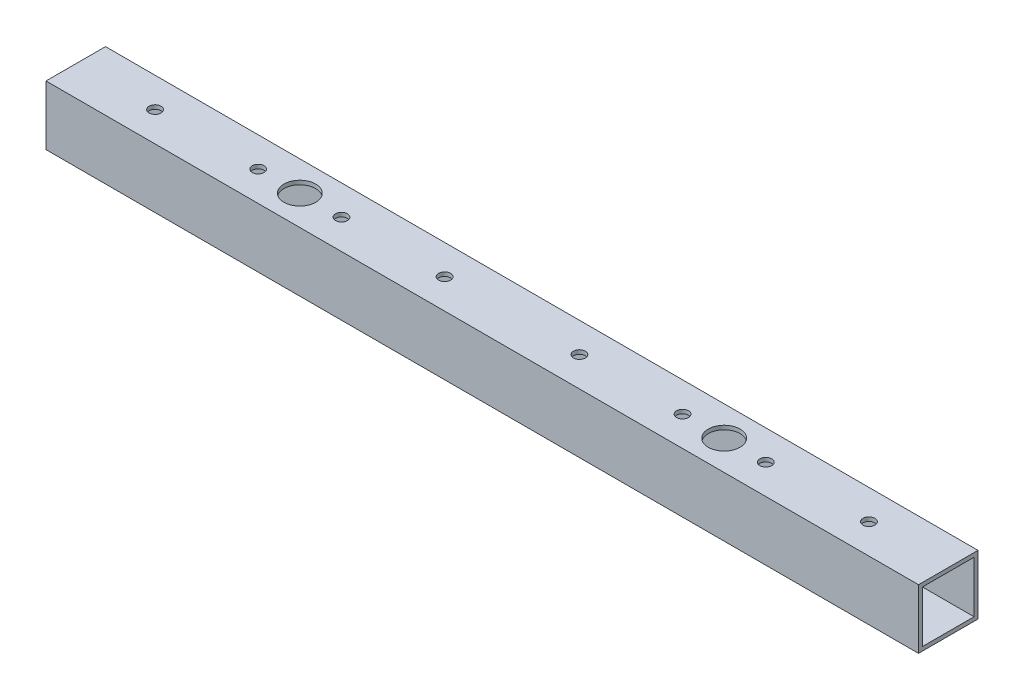
ISO-10303-21;
HEADER;
FILE_DESCRIPTION(('STEP AP214'),'2;1');
FILE_NAME('part.step','',(''),(''),'','','');
FILE_SCHEMA(('AUTOMOTIVE_DESIGN { 1 0 10303 214 1 1 1 1 }'));
ENDSEC;
DATA;
#1=APPLICATION_CONTEXT('core data for automotive mechanical design processes');
#2=APPLICATION_PROTOCOL_DEFINITION('international standard','automotive_design',2000,#1);
#3=PRODUCT_CONTEXT('',#1,'mechanical');
#4=PRODUCT('Part','Part','',(#3));
#5=PRODUCT_RELATED_PRODUCT_CATEGORY('part','',(#4));
#6=PRODUCT_DEFINITION_FORMATION('','',#4);
#7=PRODUCT_DEFINITION_CONTEXT('part definition',#1,'design');
#8=PRODUCT_DEFINITION('design','',#6,#7);
#9=PRODUCT_DEFINITION_SHAPE('','',#8);
#10=(LENGTH_UNIT() NAMED_UNIT(*) SI_UNIT(.MILLI.,.METRE.));
#11=(NAMED_UNIT(*) PLANE_ANGLE_UNIT() SI_UNIT($,.RADIAN.));
#12=(NAMED_UNIT(*) SI_UNIT($,.STERADIAN.) SOLID_ANGLE_UNIT());
#13=UNCERTAINTY_MEASURE_WITH_UNIT(LENGTH_MEASURE(1.E-05),#10,'distance_accuracy_value','');
#14=(GEOMETRIC_REPRESENTATION_CONTEXT(3) GLOBAL_UNCERTAINTY_ASSIGNED_CONTEXT((#13)) GLOBAL_UNIT_ASSIGNED_CONTEXT((#10,
#11,#12)) REPRESENTATION_CONTEXT('',''));
#15=CARTESIAN_POINT('',(0.,0.,0.));
#16=DIRECTION('',(0.,0.,1.));
#17=DIRECTION('',(1.,0.,0.));
#18=AXIS2_PLACEMENT_3D('',#15,#16,#17);
#19=CARTESIAN_POINT('',(220.,0.,0.));
#20=DIRECTION('',(-1.,0.,0.));
#21=DIRECTION('',(0.,0.,1.));
#22=AXIS2_PLACEMENT_3D('',#19,#20,#21);
#23=PLANE('',#22);
#24=DIRECTION('',(0.,1.,0.));
#25=VECTOR('',#24,1.);
#26=CARTESIAN_POINT('',(220.,-7.5,-7.5));
#27=LINE('',#26,#25);
#28=CARTESIAN_POINT('',(220.,-7.5,-7.5));
#29=VERTEX_POINT('',#28);
#30=CARTESIAN_POINT('',(220.,7.5,-7.5));
#31=VERTEX_POINT('',#30);
#32=EDGE_CURVE('E142',#29,#31,#27,.T.);
#33=ORIENTED_EDGE('',*,*,#32,.T.);
#34=DIRECTION('',(0.,0.,1.));
#35=VECTOR('',#34,1.);
#36=CARTESIAN_POINT('',(220.,7.5,7.5));
#37=LINE('',#36,#35);
#38=CARTESIAN_POINT('',(220.,7.5,7.5));
#39=VERTEX_POINT('',#38);
#40=EDGE_CURVE('E145',#31,#39,#37,.T.);
#41=ORIENTED_EDGE('',*,*,#40,.T.);
#42=DIRECTION('',(0.,-1.,0.));
#43=VECTOR('',#42,1.);
#44=CARTESIAN_POINT('',(220.,-7.5,7.5));
#45=LINE('',#44,#43);
#46=CARTESIAN_POINT('',(220.,-7.5,7.5));
#47=VERTEX_POINT('',#46);
#48=EDGE_CURVE('E148',#39,#47,#45,.T.);
#49=ORIENTED_EDGE('',*,*,#48,.T.);
#50=DIRECTION('',(0.,0.,-1.));
#51=VECTOR('',#50,1.);
#52=CARTESIAN_POINT('',(220.,-7.5,7.5));
#53=LINE('',#52,#51);
#54=EDGE_CURVE('E150',#47,#29,#53,.T.);
#55=ORIENTED_EDGE('',*,*,#54,.T.);
#56=EDGE_LOOP('',(#33,#41,#49,#55));
#57=FACE_BOUND('',#56,.T.);
#58=DIRECTION('',(0.,-1.,0.));
#59=VECTOR('',#58,1.);
#60=CARTESIAN_POINT('',(220.,-6.5,6.5));
#61=LINE('',#60,#59);
#62=CARTESIAN_POINT('',(220.,6.5,6.5));
#63=VERTEX_POINT('',#62);
#64=CARTESIAN_POINT('',(220.,-6.5,6.5));
#65=VERTEX_POINT('',#64);
#66=EDGE_CURVE('E104',#63,#65,#61,.T.);
#67=ORIENTED_EDGE('',*,*,#66,.F.);
#68=DIRECTION('',(0.,0.,1.));
#69=VECTOR('',#68,1.);
#70=CARTESIAN_POINT('',(220.,6.5,6.5));
#71=LINE('',#70,#69);
#72=CARTESIAN_POINT('',(220.,6.5,-6.5));
#73=VERTEX_POINT('',#72);
#74=EDGE_CURVE('E126',#73,#63,#71,.T.);
#75=ORIENTED_EDGE('',*,*,#74,.F.);
#76=DIRECTION('',(0.,1.,0.));
#77=VECTOR('',#76,1.);
#78=CARTESIAN_POINT('',(220.,-6.5,-6.5));
#79=LINE('',#78,#77);
#80=CARTESIAN_POINT('',(220.,-6.5,-6.5));
#81=VERTEX_POINT('',#80);
#82=EDGE_CURVE('E124',#81,#73,#79,.T.);
#83=ORIENTED_EDGE('',*,*,#82,.F.);
#84=DIRECTION('',(0.,0.,-1.));
#85=VECTOR('',#84,1.);
#86=CARTESIAN_POINT('',(220.,-6.5,6.5));
#87=LINE('',#86,#85);
#88=EDGE_CURVE('E112',#65,#81,#87,.T.);
#89=ORIENTED_EDGE('',*,*,#88,.F.);
#90=EDGE_LOOP('',(#67,#75,#83,#89));
#91=FACE_BOUND('',#90,.T.);
#92=ADVANCED_FACE('F37',(#57,#91),#23,.F.);
#93=CARTESIAN_POINT('',(0.,0.,0.));
#94=DIRECTION('',(-1.,0.,0.));
#95=DIRECTION('',(0.,0.,1.));
#96=AXIS2_PLACEMENT_3D('',#93,#94,#95);
#97=PLANE('',#96);
#98=DIRECTION('',(0.,1.,0.));
#99=VECTOR('',#98,1.);
#100=CARTESIAN_POINT('',(0.,-7.5,-7.5));
#101=LINE('',#100,#99);
#102=CARTESIAN_POINT('',(0.,-7.5,-7.5));
#103=VERTEX_POINT('',#102);
#104=CARTESIAN_POINT('',(0.,7.5,-7.5));
#105=VERTEX_POINT('',#104);
#106=EDGE_CURVE('E120',#103,#105,#101,.T.);
#107=ORIENTED_EDGE('',*,*,#106,.F.);
#108=DIRECTION('',(0.,0.,-1.));
#109=VECTOR('',#108,1.);
#110=CARTESIAN_POINT('',(0.,-7.5,7.5));
#111=LINE('',#110,#109);
#112=CARTESIAN_POINT('',(0.,-7.5,7.5));
#113=VERTEX_POINT('',#112);
#114=EDGE_CURVE('E146',#113,#103,#111,.T.);
#115=ORIENTED_EDGE('',*,*,#114,.F.);
#116=DIRECTION('',(0.,-1.,0.));
#117=VECTOR('',#116,1.);
#118=CARTESIAN_POINT('',(0.,-7.5,7.5));
#119=LINE('',#118,#117);
#120=CARTESIAN_POINT('',(0.,7.5,7.5));
#121=VERTEX_POINT('',#120);
#122=EDGE_CURVE('E157',#121,#113,#119,.T.);
#123=ORIENTED_EDGE('',*,*,#122,.F.);
#124=DIRECTION('',(0.,0.,1.));
#125=VECTOR('',#124,1.);
#126=CARTESIAN_POINT('',(0.,7.5,7.5));
#127=LINE('',#126,#125);
#128=EDGE_CURVE('E155',#105,#121,#127,.T.);
#129=ORIENTED_EDGE('',*,*,#128,.F.);
#130=EDGE_LOOP('',(#107,#115,#123,#129));
#131=FACE_BOUND('',#130,.T.);
#132=DIRECTION('',(0.,0.,1.));
#133=VECTOR('',#132,1.);
#134=CARTESIAN_POINT('',(0.,6.5,6.5));
#135=LINE('',#134,#133);
#136=CARTESIAN_POINT('',(0.,6.5,-6.5));
#137=VERTEX_POINT('',#136);
#138=CARTESIAN_POINT('',(0.,6.5,6.5));
#139=VERTEX_POINT('',#138);
#140=EDGE_CURVE('E113',#137,#139,#135,.T.);
#141=ORIENTED_EDGE('',*,*,#140,.T.);
#142=DIRECTION('',(0.,-1.,0.));
#143=VECTOR('',#142,1.);
#144=CARTESIAN_POINT('',(0.,-6.5,6.5));
#145=LINE('',#144,#143);
#146=CARTESIAN_POINT('',(0.,-6.5,6.5));
#147=VERTEX_POINT('',#146);
#148=EDGE_CURVE('E62',#139,#147,#145,.T.);
#149=ORIENTED_EDGE('',*,*,#148,.T.);
#150=DIRECTION('',(0.,0.,-1.));
#151=VECTOR('',#150,1.);
#152=CARTESIAN_POINT('',(0.,-6.5,6.5));
#153=LINE('',#152,#151);
#154=CARTESIAN_POINT('',(0.,-6.5,-6.5));
#155=VERTEX_POINT('',#154);
#156=EDGE_CURVE('E119',#147,#155,#153,.T.);
#157=ORIENTED_EDGE('',*,*,#156,.T.);
#158=DIRECTION('',(0.,1.,0.));
#159=VECTOR('',#158,1.);
#160=CARTESIAN_POINT('',(0.,-6.5,-6.5));
#161=LINE('',#160,#159);
#162=EDGE_CURVE('E134',#155,#137,#161,.T.);
#163=ORIENTED_EDGE('',*,*,#162,.T.);
#164=EDGE_LOOP('',(#141,#149,#157,#163));
#165=FACE_BOUND('',#164,.T.);
#166=ADVANCED_FACE('F288',(#131,#165),#97,.T.);
#167=CARTESIAN_POINT('',(220.,-7.5,-7.5));
#168=DIRECTION('',(0.,0.,1.));
#169=DIRECTION('',(1.,0.,0.));
#170=AXIS2_PLACEMENT_3D('',#167,#168,#169);
#171=PLANE('',#170);
#172=ORIENTED_EDGE('',*,*,#106,.T.);
#173=DIRECTION('',(-1.,0.,0.));
#174=VECTOR('',#173,1.);
#175=CARTESIAN_POINT('',(220.,7.5,-7.5));
#176=LINE('',#175,#174);
#177=EDGE_CURVE('E11',#31,#105,#176,.T.);
#178=ORIENTED_EDGE('',*,*,#177,.F.);
#179=ORIENTED_EDGE('',*,*,#32,.F.);
#180=DIRECTION('',(-1.,0.,0.));
#181=VECTOR('',#180,1.);
#182=CARTESIAN_POINT('',(220.,-7.5,-7.5));
#183=LINE('',#182,#181);
#184=EDGE_CURVE('E152',#29,#103,#183,.T.);
#185=ORIENTED_EDGE('',*,*,#184,.T.);
#186=EDGE_LOOP('',(#172,#178,#179,#185));
#187=FACE_BOUND('',#186,.T.);
#188=ADVANCED_FACE('F39',(#187),#171,.F.);
#189=CARTESIAN_POINT('',(220.,7.5,7.5));
#190=DIRECTION('',(0.,-1.,0.));
#191=DIRECTION('',(0.,0.,-1.));
#192=AXIS2_PLACEMENT_3D('',#189,#190,#191);
#193=PLANE('',#192);
#194=CARTESIAN_POINT('',(163.5,7.5,0.));
#195=DIRECTION('',(0.,1.,0.));
#196=DIRECTION('',(0.,0.,1.));
#197=AXIS2_PLACEMENT_3D('',#194,#195,#196);
#198=CIRCLE('',#197,3.99999999999999);
#199=CARTESIAN_POINT('',(163.5,7.5,3.99999999999999));
#200=VERTEX_POINT('',#199);
#201=EDGE_CURVE('E204',#200,#200,#198,.T.);
#202=ORIENTED_EDGE('',*,*,#201,.F.);
#203=EDGE_LOOP('',(#202));
#204=FACE_BOUND('',#203,.T.);
#205=CARTESIAN_POINT('',(56.5,7.5,0.));
#206=DIRECTION('',(0.,1.,0.));
#207=DIRECTION('',(0.,0.,1.));
#208=AXIS2_PLACEMENT_3D('',#205,#206,#207);
#209=CIRCLE('',#208,4.00000000000001);
#210=CARTESIAN_POINT('',(56.5,7.5,4.00000000000001));
#211=VERTEX_POINT('',#210);
#212=EDGE_CURVE('E200',#211,#211,#209,.T.);
#213=ORIENTED_EDGE('',*,*,#212,.F.);
#214=EDGE_LOOP('',(#213));
#215=FACE_BOUND('',#214,.T.);
#216=CARTESIAN_POINT('',(46.,7.5,0.));
#217=DIRECTION('',(0.,1.,0.));
#218=DIRECTION('',(0.,0.,1.));
#219=AXIS2_PLACEMENT_3D('',#216,#217,#218);
#220=CIRCLE('',#219,1.5);
#221=CARTESIAN_POINT('',(46.,7.5,1.5));
#222=VERTEX_POINT('',#221);
#223=EDGE_CURVE('E174',#222,#222,#220,.T.);
#224=ORIENTED_EDGE('',*,*,#223,.F.);
#225=EDGE_LOOP('',(#224));
#226=FACE_BOUND('',#225,.T.);
#227=CARTESIAN_POINT('',(67.,7.5,0.));
#228=DIRECTION('',(0.,1.,0.));
#229=DIRECTION('',(0.,0.,1.));
#230=AXIS2_PLACEMENT_3D('',#227,#228,#229);
#231=CIRCLE('',#230,1.5);
#232=CARTESIAN_POINT('',(67.,7.5,1.5));
#233=VERTEX_POINT('',#232);
#234=EDGE_CURVE('E245',#233,#233,#231,.T.);
#235=ORIENTED_EDGE('',*,*,#234,.F.);
#236=EDGE_LOOP('',(#235));
#237=FACE_BOUND('',#236,.T.);
#238=CARTESIAN_POINT('',(93.,7.5,0.));
#239=DIRECTION('',(0.,1.,0.));
#240=DIRECTION('',(0.,0.,1.));
#241=AXIS2_PLACEMENT_3D('',#238,#239,#240);
#242=CIRCLE('',#241,1.5);
#243=CARTESIAN_POINT('',(93.,7.5,1.5));
#244=VERTEX_POINT('',#243);
#245=EDGE_CURVE('E248',#244,#244,#242,.T.);
#246=ORIENTED_EDGE('',*,*,#245,.F.);
#247=EDGE_LOOP('',(#246));
#248=FACE_BOUND('',#247,.T.);
#249=CARTESIAN_POINT('',(127.,7.5,0.));
#250=DIRECTION('',(0.,1.,0.));
#251=DIRECTION('',(0.,0.,-1.));
#252=AXIS2_PLACEMENT_3D('',#249,#250,#251);
#253=CIRCLE('',#252,1.5);
#254=CARTESIAN_POINT('',(127.,7.5,-1.5));
#255=VERTEX_POINT('',#254);
#256=EDGE_CURVE('E251',#255,#255,#253,.T.);
#257=ORIENTED_EDGE('',*,*,#256,.F.);
#258=EDGE_LOOP('',(#257));
#259=FACE_BOUND('',#258,.T.);
#260=CARTESIAN_POINT('',(153.,7.5,0.));
#261=DIRECTION('',(0.,1.,0.));
#262=DIRECTION('',(0.,0.,-1.));
#263=AXIS2_PLACEMENT_3D('',#260,#261,#262);
#264=CIRCLE('',#263,1.50000000000003);
#265=CARTESIAN_POINT('',(153.,7.5,-1.50000000000003));
#266=VERTEX_POINT('',#265);
#267=EDGE_CURVE('E254',#266,#266,#264,.T.);
#268=ORIENTED_EDGE('',*,*,#267,.F.);
#269=EDGE_LOOP('',(#268));
#270=FACE_BOUND('',#269,.T.);
#271=CARTESIAN_POINT('',(174.,7.5,0.));
#272=DIRECTION('',(0.,1.,0.));
#273=DIRECTION('',(0.,0.,-1.));
#274=AXIS2_PLACEMENT_3D('',#271,#272,#273);
#275=CIRCLE('',#274,1.49999999999997);
#276=CARTESIAN_POINT('',(174.,7.5,-1.49999999999997));
#277=VERTEX_POINT('',#276);
#278=EDGE_CURVE('E257',#277,#277,#275,.T.);
#279=ORIENTED_EDGE('',*,*,#278,.F.);
#280=EDGE_LOOP('',(#279));
#281=FACE_BOUND('',#280,.T.);
#282=CARTESIAN_POINT('',(200.,7.5,0.));
#283=DIRECTION('',(0.,1.,0.));
#284=DIRECTION('',(0.,0.,-1.));
#285=AXIS2_PLACEMENT_3D('',#282,#283,#284);
#286=CIRCLE('',#285,1.5);
#287=CARTESIAN_POINT('',(200.,7.5,-1.5));
#288=VERTEX_POINT('',#287);
#289=EDGE_CURVE('E199',#288,#288,#286,.T.);
#290=ORIENTED_EDGE('',*,*,#289,.F.);
#291=EDGE_LOOP('',(#290));
#292=FACE_BOUND('',#291,.T.);
#293=CARTESIAN_POINT('',(20.,7.5,0.));
#294=DIRECTION('',(0.,1.,0.));
#295=DIRECTION('',(0.,0.,1.));
#296=AXIS2_PLACEMENT_3D('',#293,#294,#295);
#297=CIRCLE('',#296,1.5);
#298=CARTESIAN_POINT('',(20.,7.5,1.5));
#299=VERTEX_POINT('',#298);
#300=EDGE_CURVE('E169',#299,#299,#297,.T.);
#301=ORIENTED_EDGE('',*,*,#300,.F.);
#302=EDGE_LOOP('',(#301));
#303=FACE_BOUND('',#302,.T.);
#304=ORIENTED_EDGE('',*,*,#128,.T.);
#305=DIRECTION('',(-1.,0.,0.));
#306=VECTOR('',#305,1.);
#307=CARTESIAN_POINT('',(220.,7.5,7.5));
#308=LINE('',#307,#306);
#309=EDGE_CURVE('E46',#39,#121,#308,.T.);
#310=ORIENTED_EDGE('',*,*,#309,.F.);
#311=ORIENTED_EDGE('',*,*,#40,.F.);
#312=ORIENTED_EDGE('',*,*,#177,.T.);
#313=EDGE_LOOP('',(#304,#310,#311,#312));
#314=FACE_BOUND('',#313,.T.);
#315=ADVANCED_FACE('F274',(#204,#215,#226,#237,#248,#259,#270,#281,#292,#303,#314),#193,.F.);
#316=CARTESIAN_POINT('',(220.,-7.5,7.5));
#317=DIRECTION('',(0.,0.,-1.));
#318=DIRECTION('',(-1.,0.,0.));
#319=AXIS2_PLACEMENT_3D('',#316,#317,#318);
#320=PLANE('',#319);
#321=ORIENTED_EDGE('',*,*,#122,.T.);
#322=DIRECTION('',(-1.,0.,0.));
#323=VECTOR('',#322,1.);
#324=CARTESIAN_POINT('',(220.,-7.5,7.5));
#325=LINE('',#324,#323);
#326=EDGE_CURVE('E162',#47,#113,#325,.T.);
#327=ORIENTED_EDGE('',*,*,#326,.F.);
#328=ORIENTED_EDGE('',*,*,#48,.F.);
#329=ORIENTED_EDGE('',*,*,#309,.T.);
#330=EDGE_LOOP('',(#321,#327,#328,#329));
#331=FACE_BOUND('',#330,.T.);
#332=ADVANCED_FACE('F277',(#331),#320,.F.);
#333=CARTESIAN_POINT('',(220.,-7.5,7.5));
#334=DIRECTION('',(0.,1.,0.));
#335=DIRECTION('',(0.,0.,1.));
#336=AXIS2_PLACEMENT_3D('',#333,#334,#335);
#337=PLANE('',#336);
#338=CARTESIAN_POINT('',(46.,-7.5,0.));
#339=DIRECTION('',(0.,-1.,0.));
#340=DIRECTION('',(0.,0.,-1.));
#341=AXIS2_PLACEMENT_3D('',#338,#339,#340);
#342=CIRCLE('',#341,4.);
#343=CARTESIAN_POINT('',(46.,-7.5,-4.));
#344=VERTEX_POINT('',#343);
#345=EDGE_CURVE('E213',#344,#344,#342,.T.);
#346=ORIENTED_EDGE('',*,*,#345,.F.);
#347=EDGE_LOOP('',(#346));
#348=FACE_BOUND('',#347,.T.);
#349=CARTESIAN_POINT('',(67.,-7.5,0.));
#350=DIRECTION('',(0.,-1.,0.));
#351=DIRECTION('',(0.,0.,-1.));
#352=AXIS2_PLACEMENT_3D('',#349,#350,#351);
#353=CIRCLE('',#352,4.00000000000001);
#354=CARTESIAN_POINT('',(67.,-7.5,-4.00000000000001));
#355=VERTEX_POINT('',#354);
#356=EDGE_CURVE('E580',#355,#355,#353,.T.);
#357=ORIENTED_EDGE('',*,*,#356,.F.);
#358=EDGE_LOOP('',(#357));
#359=FACE_BOUND('',#358,.T.);
#360=CARTESIAN_POINT('',(93.,-7.5,0.));
#361=DIRECTION('',(0.,-1.,0.));
#362=DIRECTION('',(0.,0.,-1.));
#363=AXIS2_PLACEMENT_3D('',#360,#361,#362);
#364=CIRCLE('',#363,4.00000000000001);
#365=CARTESIAN_POINT('',(93.,-7.5,-4.00000000000001));
#366=VERTEX_POINT('',#365);
#367=EDGE_CURVE('E583',#366,#366,#364,.T.);
#368=ORIENTED_EDGE('',*,*,#367,.F.);
#369=EDGE_LOOP('',(#368));
#370=FACE_BOUND('',#369,.T.);
#371=CARTESIAN_POINT('',(127.,-7.5,0.));
#372=DIRECTION('',(0.,-1.,0.));
#373=DIRECTION('',(0.,0.,-1.));
#374=AXIS2_PLACEMENT_3D('',#371,#372,#373);
#375=CIRCLE('',#374,3.99999999999999);
#376=CARTESIAN_POINT('',(127.,-7.5,-3.99999999999999));
#377=VERTEX_POINT('',#376);
#378=EDGE_CURVE('E588',#377,#377,#375,.T.);
#379=ORIENTED_EDGE('',*,*,#378,.F.);
#380=EDGE_LOOP('',(#379));
#381=FACE_BOUND('',#380,.T.);
#382=CARTESIAN_POINT('',(153.,-7.5,0.));
#383=DIRECTION('',(0.,-1.,0.));
#384=DIRECTION('',(0.,0.,-1.));
#385=AXIS2_PLACEMENT_3D('',#382,#383,#384);
#386=CIRCLE('',#385,3.99999999999999);
#387=CARTESIAN_POINT('',(153.,-7.5,-3.99999999999999));
#388=VERTEX_POINT('',#387);
#389=EDGE_CURVE('E591',#388,#388,#386,.T.);
#390=ORIENTED_EDGE('',*,*,#389,.F.);
#391=EDGE_LOOP('',(#390));
#392=FACE_BOUND('',#391,.T.);
#393=CARTESIAN_POINT('',(174.,-7.5,0.));
#394=DIRECTION('',(0.,-1.,0.));
#395=DIRECTION('',(0.,0.,-1.));
#396=AXIS2_PLACEMENT_3D('',#393,#394,#395);
#397=CIRCLE('',#396,3.99999999999999);
#398=CARTESIAN_POINT('',(174.,-7.5,-3.99999999999999));
#399=VERTEX_POINT('',#398);
#400=EDGE_CURVE('E593',#399,#399,#397,.T.);
#401=ORIENTED_EDGE('',*,*,#400,.F.);
#402=EDGE_LOOP('',(#401));
#403=FACE_BOUND('',#402,.T.);
#404=CARTESIAN_POINT('',(200.,-7.5,0.));
#405=DIRECTION('',(0.,-1.,0.));
#406=DIRECTION('',(0.,0.,-1.));
#407=AXIS2_PLACEMENT_3D('',#404,#405,#406);
#408=CIRCLE('',#407,3.99999999999999);
#409=CARTESIAN_POINT('',(200.,-7.5,-3.99999999999999));
#410=VERTEX_POINT('',#409);
#411=EDGE_CURVE('E237',#410,#410,#408,.T.);
#412=ORIENTED_EDGE('',*,*,#411,.F.);
#413=EDGE_LOOP('',(#412));
#414=FACE_BOUND('',#413,.T.);
#415=CARTESIAN_POINT('',(20.,-7.5,0.));
#416=DIRECTION('',(0.,-1.,0.));
#417=DIRECTION('',(0.,0.,-1.));
#418=AXIS2_PLACEMENT_3D('',#415,#416,#417);
#419=CIRCLE('',#418,4.);
#420=CARTESIAN_POINT('',(20.,-7.5,-4.));
#421=VERTEX_POINT('',#420);
#422=EDGE_CURVE('E208',#421,#421,#419,.T.);
#423=ORIENTED_EDGE('',*,*,#422,.F.);
#424=EDGE_LOOP('',(#423));
#425=FACE_BOUND('',#424,.T.);
#426=CARTESIAN_POINT('',(56.5,-7.50000000000001,0.));
#427=DIRECTION('',(0.,1.,0.));
#428=DIRECTION('',(0.,0.,1.));
#429=AXIS2_PLACEMENT_3D('',#426,#427,#428);
#430=CIRCLE('',#429,1.5);
#431=CARTESIAN_POINT('',(56.5,-7.50000000000001,1.5));
#432=VERTEX_POINT('',#431);
#433=EDGE_CURVE('E195',#432,#432,#430,.T.);
#434=ORIENTED_EDGE('',*,*,#433,.T.);
#435=EDGE_LOOP('',(#434));
#436=FACE_BOUND('',#435,.T.);
#437=CARTESIAN_POINT('',(163.5,-7.50000000000001,0.));
#438=DIRECTION('',(0.,1.,0.));
#439=DIRECTION('',(0.,0.,1.));
#440=AXIS2_PLACEMENT_3D('',#437,#438,#439);
#441=CIRCLE('',#440,1.5);
#442=CARTESIAN_POINT('',(163.5,-7.50000000000001,1.5));
#443=VERTEX_POINT('',#442);
#444=EDGE_CURVE('E182',#443,#443,#441,.T.);
#445=ORIENTED_EDGE('',*,*,#444,.T.);
#446=EDGE_LOOP('',(#445));
#447=FACE_BOUND('',#446,.T.);
#448=ORIENTED_EDGE('',*,*,#114,.T.);
#449=ORIENTED_EDGE('',*,*,#184,.F.);
#450=ORIENTED_EDGE('',*,*,#54,.F.);
#451=ORIENTED_EDGE('',*,*,#326,.T.);
#452=EDGE_LOOP('',(#448,#449,#450,#451));
#453=FACE_BOUND('',#452,.T.);
#454=ADVANCED_FACE('F292',(#348,#359,#370,#381,#392,#403,#414,#425,#436,#447,#453),#337,.F.);
#455=CARTESIAN_POINT('',(220.,-6.5,6.5));
#456=DIRECTION('',(0.,0.,-1.));
#457=DIRECTION('',(-1.,0.,0.));
#458=AXIS2_PLACEMENT_3D('',#455,#456,#457);
#459=PLANE('',#458);
#460=ORIENTED_EDGE('',*,*,#148,.F.);
#461=DIRECTION('',(-1.,0.,0.));
#462=VECTOR('',#461,1.);
#463=CARTESIAN_POINT('',(220.,6.5,6.5));
#464=LINE('',#463,#462);
#465=EDGE_CURVE('E108',#63,#139,#464,.T.);
#466=ORIENTED_EDGE('',*,*,#465,.F.);
#467=ORIENTED_EDGE('',*,*,#66,.T.);
#468=DIRECTION('',(-1.,0.,0.));
#469=VECTOR('',#468,1.);
#470=CARTESIAN_POINT('',(220.,-6.5,6.5));
#471=LINE('',#470,#469);
#472=EDGE_CURVE('E107',#65,#147,#471,.T.);
#473=ORIENTED_EDGE('',*,*,#472,.T.);
#474=EDGE_LOOP('',(#460,#466,#467,#473));
#475=FACE_BOUND('',#474,.T.);
#476=ADVANCED_FACE('F106',(#475),#459,.T.);
#477=CARTESIAN_POINT('',(220.,-6.5,6.5));
#478=DIRECTION('',(0.,1.,0.));
#479=DIRECTION('',(0.,0.,1.));
#480=AXIS2_PLACEMENT_3D('',#477,#478,#479);
#481=PLANE('',#480);
#482=CARTESIAN_POINT('',(46.,-6.5,0.));
#483=DIRECTION('',(0.,1.,0.));
#484=DIRECTION('',(0.,0.,1.));
#485=AXIS2_PLACEMENT_3D('',#482,#483,#484);
#486=CIRCLE('',#485,4.);
#487=CARTESIAN_POINT('',(46.,-6.5,4.));
#488=VERTEX_POINT('',#487);
#489=EDGE_CURVE('E41',#488,#488,#486,.T.);
#490=ORIENTED_EDGE('',*,*,#489,.F.);
#491=EDGE_LOOP('',(#490));
#492=FACE_BOUND('',#491,.T.);
#493=CARTESIAN_POINT('',(67.,-6.5,0.));
#494=DIRECTION('',(0.,1.,0.));
#495=DIRECTION('',(0.,0.,1.));
#496=AXIS2_PLACEMENT_3D('',#493,#494,#495);
#497=CIRCLE('',#496,4.00000000000001);
#498=CARTESIAN_POINT('',(67.,-6.5,4.00000000000001));
#499=VERTEX_POINT('',#498);
#500=EDGE_CURVE('E224',#499,#499,#497,.T.);
#501=ORIENTED_EDGE('',*,*,#500,.F.);
#502=EDGE_LOOP('',(#501));
#503=FACE_BOUND('',#502,.T.);
#504=CARTESIAN_POINT('',(93.,-6.5,0.));
#505=DIRECTION('',(0.,1.,0.));
#506=DIRECTION('',(0.,0.,1.));
#507=AXIS2_PLACEMENT_3D('',#504,#505,#506);
#508=CIRCLE('',#507,4.00000000000001);
#509=CARTESIAN_POINT('',(93.,-6.5,4.00000000000001));
#510=VERTEX_POINT('',#509);
#511=EDGE_CURVE('E222',#510,#510,#508,.T.);
#512=ORIENTED_EDGE('',*,*,#511,.F.);
#513=EDGE_LOOP('',(#512));
#514=FACE_BOUND('',#513,.T.);
#515=CARTESIAN_POINT('',(127.,-6.5,0.));
#516=DIRECTION('',(0.,1.,0.));
#517=DIRECTION('',(0.,0.,1.));
#518=AXIS2_PLACEMENT_3D('',#515,#516,#517);
#519=CIRCLE('',#518,3.99999999999999);
#520=CARTESIAN_POINT('',(127.,-6.5,3.99999999999999));
#521=VERTEX_POINT('',#520);
#522=EDGE_CURVE('E219',#521,#521,#519,.T.);
#523=ORIENTED_EDGE('',*,*,#522,.F.);
#524=EDGE_LOOP('',(#523));
#525=FACE_BOUND('',#524,.T.);
#526=CARTESIAN_POINT('',(153.,-6.5,0.));
#527=DIRECTION('',(0.,1.,0.));
#528=DIRECTION('',(0.,0.,1.));
#529=AXIS2_PLACEMENT_3D('',#526,#527,#528);
#530=CIRCLE('',#529,3.99999999999999);
#531=CARTESIAN_POINT('',(153.,-6.5,3.99999999999999));
#532=VERTEX_POINT('',#531);
#533=EDGE_CURVE('E216',#532,#532,#530,.T.);
#534=ORIENTED_EDGE('',*,*,#533,.F.);
#535=EDGE_LOOP('',(#534));
#536=FACE_BOUND('',#535,.T.);
#537=CARTESIAN_POINT('',(174.,-6.5,0.));
#538=DIRECTION('',(0.,1.,0.));
#539=DIRECTION('',(0.,0.,1.));
#540=AXIS2_PLACEMENT_3D('',#537,#538,#539);
#541=CIRCLE('',#540,3.99999999999999);
#542=CARTESIAN_POINT('',(174.,-6.5,3.99999999999999));
#543=VERTEX_POINT('',#542);
#544=EDGE_CURVE('E212',#543,#543,#541,.T.);
#545=ORIENTED_EDGE('',*,*,#544,.F.);
#546=EDGE_LOOP('',(#545));
#547=FACE_BOUND('',#546,.T.);
#548=CARTESIAN_POINT('',(200.,-6.5,0.));
#549=DIRECTION('',(0.,1.,0.));
#550=DIRECTION('',(0.,0.,1.));
#551=AXIS2_PLACEMENT_3D('',#548,#549,#550);
#552=CIRCLE('',#551,3.99999999999999);
#553=CARTESIAN_POINT('',(200.,-6.5,3.99999999999999));
#554=VERTEX_POINT('',#553);
#555=EDGE_CURVE('E209',#554,#554,#552,.T.);
#556=ORIENTED_EDGE('',*,*,#555,.F.);
#557=EDGE_LOOP('',(#556));
#558=FACE_BOUND('',#557,.T.);
#559=CARTESIAN_POINT('',(20.,-6.5,0.));
#560=DIRECTION('',(0.,1.,0.));
#561=DIRECTION('',(0.,0.,1.));
#562=AXIS2_PLACEMENT_3D('',#559,#560,#561);
#563=CIRCLE('',#562,4.);
#564=CARTESIAN_POINT('',(20.,-6.5,4.));
#565=VERTEX_POINT('',#564);
#566=EDGE_CURVE('E205',#565,#565,#563,.T.);
#567=ORIENTED_EDGE('',*,*,#566,.F.);
#568=EDGE_LOOP('',(#567));
#569=FACE_BOUND('',#568,.T.);
#570=CARTESIAN_POINT('',(56.5,-6.50000000000001,0.));
#571=DIRECTION('',(0.,1.,0.));
#572=DIRECTION('',(0.,0.,1.));
#573=AXIS2_PLACEMENT_3D('',#570,#571,#572);
#574=CIRCLE('',#573,1.5);
#575=CARTESIAN_POINT('',(56.5,-6.50000000000001,1.5));
#576=VERTEX_POINT('',#575);
#577=EDGE_CURVE('E191',#576,#576,#574,.T.);
#578=ORIENTED_EDGE('',*,*,#577,.F.);
#579=EDGE_LOOP('',(#578));
#580=FACE_BOUND('',#579,.T.);
#581=CARTESIAN_POINT('',(163.5,-6.50000000000001,0.));
#582=DIRECTION('',(0.,1.,0.));
#583=DIRECTION('',(0.,0.,1.));
#584=AXIS2_PLACEMENT_3D('',#581,#582,#583);
#585=CIRCLE('',#584,1.5);
#586=CARTESIAN_POINT('',(163.5,-6.50000000000001,1.5));
#587=VERTEX_POINT('',#586);
#588=EDGE_CURVE('E177',#587,#587,#585,.T.);
#589=ORIENTED_EDGE('',*,*,#588,.F.);
#590=EDGE_LOOP('',(#589));
#591=FACE_BOUND('',#590,.T.);
#592=ORIENTED_EDGE('',*,*,#156,.F.);
#593=ORIENTED_EDGE('',*,*,#472,.F.);
#594=ORIENTED_EDGE('',*,*,#88,.T.);
#595=DIRECTION('',(-1.,0.,0.));
#596=VECTOR('',#595,1.);
#597=CARTESIAN_POINT('',(220.,-6.5,-6.5));
#598=LINE('',#597,#596);
#599=EDGE_CURVE('E121',#81,#155,#598,.T.);
#600=ORIENTED_EDGE('',*,*,#599,.T.);
#601=EDGE_LOOP('',(#592,#593,#594,#600));
#602=FACE_BOUND('',#601,.T.);
#603=ADVANCED_FACE('F116',(#492,#503,#514,#525,#536,#547,#558,#569,#580,#591,#602),#481,.T.);
#604=CARTESIAN_POINT('',(220.,-6.5,-6.5));
#605=DIRECTION('',(0.,0.,1.));
#606=DIRECTION('',(0.,-1.,0.));
#607=AXIS2_PLACEMENT_3D('',#604,#605,#606);
#608=PLANE('',#607);
#609=ORIENTED_EDGE('',*,*,#162,.F.);
#610=ORIENTED_EDGE('',*,*,#599,.F.);
#611=ORIENTED_EDGE('',*,*,#82,.T.);
#612=DIRECTION('',(-1.,0.,0.));
#613=VECTOR('',#612,1.);
#614=CARTESIAN_POINT('',(220.,6.5,-6.5));
#615=LINE('',#614,#613);
#616=EDGE_CURVE('E54',#73,#137,#615,.T.);
#617=ORIENTED_EDGE('',*,*,#616,.T.);
#618=EDGE_LOOP('',(#609,#610,#611,#617));
#619=FACE_BOUND('',#618,.T.);
#620=ADVANCED_FACE('F333',(#619),#608,.T.);
#621=CARTESIAN_POINT('',(220.,6.5,6.5));
#622=DIRECTION('',(0.,-1.,0.));
#623=DIRECTION('',(0.,0.,-1.));
#624=AXIS2_PLACEMENT_3D('',#621,#622,#623);
#625=PLANE('',#624);
#626=CARTESIAN_POINT('',(163.5,6.5,0.));
#627=DIRECTION('',(0.,-1.,0.));
#628=DIRECTION('',(0.,0.,-1.));
#629=AXIS2_PLACEMENT_3D('',#626,#627,#628);
#630=CIRCLE('',#629,3.99999999999999);
#631=CARTESIAN_POINT('',(163.5,6.5,-3.99999999999999));
#632=VERTEX_POINT('',#631);
#633=EDGE_CURVE('E201',#632,#632,#630,.T.);
#634=ORIENTED_EDGE('',*,*,#633,.F.);
#635=EDGE_LOOP('',(#634));
#636=FACE_BOUND('',#635,.T.);
#637=CARTESIAN_POINT('',(56.5,6.5,0.));
#638=DIRECTION('',(0.,-1.,0.));
#639=DIRECTION('',(0.,0.,-1.));
#640=AXIS2_PLACEMENT_3D('',#637,#638,#639);
#641=CIRCLE('',#640,4.00000000000001);
#642=CARTESIAN_POINT('',(56.5,6.5,-4.00000000000001));
#643=VERTEX_POINT('',#642);
#644=EDGE_CURVE('E196',#643,#643,#641,.T.);
#645=ORIENTED_EDGE('',*,*,#644,.F.);
#646=EDGE_LOOP('',(#645));
#647=FACE_BOUND('',#646,.T.);
#648=CARTESIAN_POINT('',(46.,6.50000000000001,0.));
#649=DIRECTION('',(0.,-1.,0.));
#650=DIRECTION('',(0.,0.,-1.));
#651=AXIS2_PLACEMENT_3D('',#648,#649,#650);
#652=CIRCLE('',#651,1.5);
#653=CARTESIAN_POINT('',(46.,6.50000000000001,-1.5));
#654=VERTEX_POINT('',#653);
#655=EDGE_CURVE('E192',#654,#654,#652,.T.);
#656=ORIENTED_EDGE('',*,*,#655,.F.);
#657=EDGE_LOOP('',(#656));
#658=FACE_BOUND('',#657,.T.);
#659=CARTESIAN_POINT('',(67.,6.50000000000001,0.));
#660=DIRECTION('',(0.,-1.,0.));
#661=DIRECTION('',(0.,0.,-1.));
#662=AXIS2_PLACEMENT_3D('',#659,#660,#661);
#663=CIRCLE('',#662,1.5);
#664=CARTESIAN_POINT('',(67.,6.50000000000001,-1.5));
#665=VERTEX_POINT('',#664);
#666=EDGE_CURVE('E188',#665,#665,#663,.T.);
#667=ORIENTED_EDGE('',*,*,#666,.F.);
#668=EDGE_LOOP('',(#667));
#669=FACE_BOUND('',#668,.T.);
#670=CARTESIAN_POINT('',(93.,6.50000000000001,0.));
#671=DIRECTION('',(0.,-1.,0.));
#672=DIRECTION('',(0.,0.,-1.));
#673=AXIS2_PLACEMENT_3D('',#670,#671,#672);
#674=CIRCLE('',#673,1.5);
#675=CARTESIAN_POINT('',(93.,6.50000000000001,-1.5));
#676=VERTEX_POINT('',#675);
#677=EDGE_CURVE('E185',#676,#676,#674,.T.);
#678=ORIENTED_EDGE('',*,*,#677,.F.);
#679=EDGE_LOOP('',(#678));
#680=FACE_BOUND('',#679,.T.);
#681=CARTESIAN_POINT('',(127.,6.50000000000001,0.));
#682=DIRECTION('',(0.,-1.,0.));
#683=DIRECTION('',(0.,0.,-1.));
#684=AXIS2_PLACEMENT_3D('',#681,#682,#683);
#685=CIRCLE('',#684,1.5);
#686=CARTESIAN_POINT('',(127.,6.50000000000001,-1.5));
#687=VERTEX_POINT('',#686);
#688=EDGE_CURVE('E181',#687,#687,#685,.T.);
#689=ORIENTED_EDGE('',*,*,#688,.F.);
#690=EDGE_LOOP('',(#689));
#691=FACE_BOUND('',#690,.T.);
#692=CARTESIAN_POINT('',(153.,6.50000000000001,0.));
#693=DIRECTION('',(0.,-1.,0.));
#694=DIRECTION('',(0.,0.,-1.));
#695=AXIS2_PLACEMENT_3D('',#692,#693,#694);
#696=CIRCLE('',#695,1.50000000000003);
#697=CARTESIAN_POINT('',(153.,6.50000000000001,-1.50000000000003));
#698=VERTEX_POINT('',#697);
#699=EDGE_CURVE('E178',#698,#698,#696,.T.);
#700=ORIENTED_EDGE('',*,*,#699,.F.);
#701=EDGE_LOOP('',(#700));
#702=FACE_BOUND('',#701,.T.);
#703=CARTESIAN_POINT('',(174.,6.50000000000001,0.));
#704=DIRECTION('',(0.,-1.,0.));
#705=DIRECTION('',(0.,0.,-1.));
#706=AXIS2_PLACEMENT_3D('',#703,#704,#705);
#707=CIRCLE('',#706,1.49999999999997);
#708=CARTESIAN_POINT('',(174.,6.50000000000001,-1.49999999999997));
#709=VERTEX_POINT('',#708);
#710=EDGE_CURVE('E173',#709,#709,#707,.T.);
#711=ORIENTED_EDGE('',*,*,#710,.F.);
#712=EDGE_LOOP('',(#711));
#713=FACE_BOUND('',#712,.T.);
#714=CARTESIAN_POINT('',(200.,6.50000000000001,0.));
#715=DIRECTION('',(0.,-1.,0.));
#716=DIRECTION('',(0.,0.,-1.));
#717=AXIS2_PLACEMENT_3D('',#714,#715,#716);
#718=CIRCLE('',#717,1.5);
#719=CARTESIAN_POINT('',(200.,6.50000000000001,-1.5));
#720=VERTEX_POINT('',#719);
#721=EDGE_CURVE('E170',#720,#720,#718,.T.);
#722=ORIENTED_EDGE('',*,*,#721,.F.);
#723=EDGE_LOOP('',(#722));
#724=FACE_BOUND('',#723,.T.);
#725=CARTESIAN_POINT('',(20.,6.50000000000001,0.));
#726=DIRECTION('',(0.,-1.,0.));
#727=DIRECTION('',(0.,0.,-1.));
#728=AXIS2_PLACEMENT_3D('',#725,#726,#727);
#729=CIRCLE('',#728,1.5);
#730=CARTESIAN_POINT('',(20.,6.50000000000001,-1.5));
#731=VERTEX_POINT('',#730);
#732=EDGE_CURVE('E132',#731,#731,#729,.T.);
#733=ORIENTED_EDGE('',*,*,#732,.F.);
#734=EDGE_LOOP('',(#733));
#735=FACE_BOUND('',#734,.T.);
#736=ORIENTED_EDGE('',*,*,#140,.F.);
#737=ORIENTED_EDGE('',*,*,#616,.F.);
#738=ORIENTED_EDGE('',*,*,#74,.T.);
#739=ORIENTED_EDGE('',*,*,#465,.T.);
#740=EDGE_LOOP('',(#736,#737,#738,#739));
#741=FACE_BOUND('',#740,.T.);
#742=ADVANCED_FACE('F340',(#636,#647,#658,#669,#680,#691,#702,#713,#724,#735,#741),#625,.T.);
#743=CARTESIAN_POINT('',(20.,-222.5,0.));
#744=DIRECTION('',(0.,1.,0.));
#745=DIRECTION('',(0.,0.,1.));
#746=AXIS2_PLACEMENT_3D('',#743,#744,#745);
#747=CYLINDRICAL_SURFACE('',#746,1.5);
#748=ORIENTED_EDGE('',*,*,#732,.T.);
#749=EDGE_LOOP('',(#748));
#750=FACE_BOUND('',#749,.T.);
#751=ORIENTED_EDGE('',*,*,#300,.T.);
#752=EDGE_LOOP('',(#751));
#753=FACE_BOUND('',#752,.T.);
#754=ADVANCED_FACE('F272',(#750,#753),#747,.F.);
#755=CARTESIAN_POINT('',(200.,-222.5,0.));
#756=DIRECTION('',(0.,1.,0.));
#757=DIRECTION('',(0.,0.,1.));
#758=AXIS2_PLACEMENT_3D('',#755,#756,#757);
#759=CYLINDRICAL_SURFACE('',#758,1.5);
#760=ORIENTED_EDGE('',*,*,#721,.T.);
#761=EDGE_LOOP('',(#760));
#762=FACE_BOUND('',#761,.T.);
#763=ORIENTED_EDGE('',*,*,#289,.T.);
#764=EDGE_LOOP('',(#763));
#765=FACE_BOUND('',#764,.T.);
#766=ADVANCED_FACE('F356',(#762,#765),#759,.F.);
#767=CARTESIAN_POINT('',(174.,-222.5,0.));
#768=DIRECTION('',(0.,1.,0.));
#769=DIRECTION('',(0.,0.,1.));
#770=AXIS2_PLACEMENT_3D('',#767,#768,#769);
#771=CYLINDRICAL_SURFACE('',#770,1.49999999999997);
#772=ORIENTED_EDGE('',*,*,#710,.T.);
#773=EDGE_LOOP('',(#772));
#774=FACE_BOUND('',#773,.T.);
#775=ORIENTED_EDGE('',*,*,#278,.T.);
#776=EDGE_LOOP('',(#775));
#777=FACE_BOUND('',#776,.T.);
#778=ADVANCED_FACE('F364',(#774,#777),#771,.F.);
#779=CARTESIAN_POINT('',(153.,-222.5,0.));
#780=DIRECTION('',(0.,1.,0.));
#781=DIRECTION('',(0.,0.,1.));
#782=AXIS2_PLACEMENT_3D('',#779,#780,#781);
#783=CYLINDRICAL_SURFACE('',#782,1.50000000000003);
#784=ORIENTED_EDGE('',*,*,#699,.T.);
#785=EDGE_LOOP('',(#784));
#786=FACE_BOUND('',#785,.T.);
#787=ORIENTED_EDGE('',*,*,#267,.T.);
#788=EDGE_LOOP('',(#787));
#789=FACE_BOUND('',#788,.T.);
#790=ADVANCED_FACE('F372',(#786,#789),#783,.F.);
#791=CARTESIAN_POINT('',(127.,-222.5,0.));
#792=DIRECTION('',(0.,1.,0.));
#793=DIRECTION('',(0.,0.,1.));
#794=AXIS2_PLACEMENT_3D('',#791,#792,#793);
#795=CYLINDRICAL_SURFACE('',#794,1.5);
#796=ORIENTED_EDGE('',*,*,#688,.T.);
#797=EDGE_LOOP('',(#796));
#798=FACE_BOUND('',#797,.T.);
#799=ORIENTED_EDGE('',*,*,#256,.T.);
#800=EDGE_LOOP('',(#799));
#801=FACE_BOUND('',#800,.T.);
#802=ADVANCED_FACE('F380',(#798,#801),#795,.F.);
#803=CARTESIAN_POINT('',(93.,-222.5,0.));
#804=DIRECTION('',(0.,1.,0.));
#805=DIRECTION('',(0.,0.,1.));
#806=AXIS2_PLACEMENT_3D('',#803,#804,#805);
#807=CYLINDRICAL_SURFACE('',#806,1.5);
#808=ORIENTED_EDGE('',*,*,#677,.T.);
#809=EDGE_LOOP('',(#808));
#810=FACE_BOUND('',#809,.T.);
#811=ORIENTED_EDGE('',*,*,#245,.T.);
#812=EDGE_LOOP('',(#811));
#813=FACE_BOUND('',#812,.T.);
#814=ADVANCED_FACE('F388',(#810,#813),#807,.F.);
#815=CARTESIAN_POINT('',(67.,-222.5,0.));
#816=DIRECTION('',(0.,1.,0.));
#817=DIRECTION('',(0.,0.,1.));
#818=AXIS2_PLACEMENT_3D('',#815,#816,#817);
#819=CYLINDRICAL_SURFACE('',#818,1.5);
#820=ORIENTED_EDGE('',*,*,#666,.T.);
#821=EDGE_LOOP('',(#820));
#822=FACE_BOUND('',#821,.T.);
#823=ORIENTED_EDGE('',*,*,#234,.T.);
#824=EDGE_LOOP('',(#823));
#825=FACE_BOUND('',#824,.T.);
#826=ADVANCED_FACE('F396',(#822,#825),#819,.F.);
#827=CARTESIAN_POINT('',(46.,-222.5,0.));
#828=DIRECTION('',(0.,1.,0.));
#829=DIRECTION('',(0.,0.,1.));
#830=AXIS2_PLACEMENT_3D('',#827,#828,#829);
#831=CYLINDRICAL_SURFACE('',#830,1.5);
#832=ORIENTED_EDGE('',*,*,#655,.T.);
#833=EDGE_LOOP('',(#832));
#834=FACE_BOUND('',#833,.T.);
#835=ORIENTED_EDGE('',*,*,#223,.T.);
#836=EDGE_LOOP('',(#835));
#837=FACE_BOUND('',#836,.T.);
#838=ADVANCED_FACE('F404',(#834,#837),#831,.F.);
#839=CARTESIAN_POINT('',(163.5,-222.5,0.));
#840=DIRECTION('',(0.,1.,0.));
#841=DIRECTION('',(0.,0.,1.));
#842=AXIS2_PLACEMENT_3D('',#839,#840,#841);
#843=CYLINDRICAL_SURFACE('',#842,1.5);
#844=ORIENTED_EDGE('',*,*,#588,.T.);
#845=EDGE_LOOP('',(#844));
#846=FACE_BOUND('',#845,.T.);
#847=ORIENTED_EDGE('',*,*,#444,.F.);
#848=EDGE_LOOP('',(#847));
#849=FACE_BOUND('',#848,.T.);
#850=ADVANCED_FACE('F412',(#846,#849),#843,.F.);
#851=CARTESIAN_POINT('',(56.5,-222.5,0.));
#852=DIRECTION('',(0.,1.,0.));
#853=DIRECTION('',(0.,0.,1.));
#854=AXIS2_PLACEMENT_3D('',#851,#852,#853);
#855=CYLINDRICAL_SURFACE('',#854,1.5);
#856=ORIENTED_EDGE('',*,*,#577,.T.);
#857=EDGE_LOOP('',(#856));
#858=FACE_BOUND('',#857,.T.);
#859=ORIENTED_EDGE('',*,*,#433,.F.);
#860=EDGE_LOOP('',(#859));
#861=FACE_BOUND('',#860,.T.);
#862=ADVANCED_FACE('F420',(#858,#861),#855,.F.);
#863=CARTESIAN_POINT('',(56.5,4.5,0.));
#864=DIRECTION('',(0.,1.,0.));
#865=DIRECTION('',(0.,0.,1.));
#866=AXIS2_PLACEMENT_3D('',#863,#864,#865);
#867=CYLINDRICAL_SURFACE('',#866,4.00000000000001);
#868=ORIENTED_EDGE('',*,*,#644,.T.);
#869=EDGE_LOOP('',(#868));
#870=FACE_BOUND('',#869,.T.);
#871=ORIENTED_EDGE('',*,*,#212,.T.);
#872=EDGE_LOOP('',(#871));
#873=FACE_BOUND('',#872,.T.);
#874=ADVANCED_FACE('F428',(#870,#873),#867,.F.);
#875=CARTESIAN_POINT('',(163.5,4.5,0.));
#876=DIRECTION('',(0.,1.,0.));
#877=DIRECTION('',(0.,0.,1.));
#878=AXIS2_PLACEMENT_3D('',#875,#876,#877);
#879=CYLINDRICAL_SURFACE('',#878,3.99999999999999);
#880=ORIENTED_EDGE('',*,*,#633,.T.);
#881=EDGE_LOOP('',(#880));
#882=FACE_BOUND('',#881,.T.);
#883=ORIENTED_EDGE('',*,*,#201,.T.);
#884=EDGE_LOOP('',(#883));
#885=FACE_BOUND('',#884,.T.);
#886=ADVANCED_FACE('F435',(#882,#885),#879,.F.);
#887=CARTESIAN_POINT('',(20.,-4.5,0.));
#888=DIRECTION('',(0.,-1.,0.));
#889=DIRECTION('',(0.,0.,-1.));
#890=AXIS2_PLACEMENT_3D('',#887,#888,#889);
#891=CYLINDRICAL_SURFACE('',#890,4.);
#892=ORIENTED_EDGE('',*,*,#566,.T.);
#893=EDGE_LOOP('',(#892));
#894=FACE_BOUND('',#893,.T.);
#895=ORIENTED_EDGE('',*,*,#422,.T.);
#896=EDGE_LOOP('',(#895));
#897=FACE_BOUND('',#896,.T.);
#898=ADVANCED_FACE('F442',(#894,#897),#891,.F.);
#899=CARTESIAN_POINT('',(200.,-4.5,0.));
#900=DIRECTION('',(0.,-1.,0.));
#901=DIRECTION('',(0.,0.,-1.));
#902=AXIS2_PLACEMENT_3D('',#899,#900,#901);
#903=CYLINDRICAL_SURFACE('',#902,3.99999999999999);
#904=ORIENTED_EDGE('',*,*,#555,.T.);
#905=EDGE_LOOP('',(#904));
#906=FACE_BOUND('',#905,.T.);
#907=ORIENTED_EDGE('',*,*,#411,.T.);
#908=EDGE_LOOP('',(#907));
#909=FACE_BOUND('',#908,.T.);
#910=ADVANCED_FACE('F449',(#906,#909),#903,.F.);
#911=CARTESIAN_POINT('',(174.,-4.5,0.));
#912=DIRECTION('',(0.,-1.,0.));
#913=DIRECTION('',(0.,0.,-1.));
#914=AXIS2_PLACEMENT_3D('',#911,#912,#913);
#915=CYLINDRICAL_SURFACE('',#914,3.99999999999999);
#916=ORIENTED_EDGE('',*,*,#544,.T.);
#917=EDGE_LOOP('',(#916));
#918=FACE_BOUND('',#917,.T.);
#919=ORIENTED_EDGE('',*,*,#400,.T.);
#920=EDGE_LOOP('',(#919));
#921=FACE_BOUND('',#920,.T.);
#922=ADVANCED_FACE('F457',(#918,#921),#915,.F.);
#923=CARTESIAN_POINT('',(153.,-4.5,0.));
#924=DIRECTION('',(0.,-1.,0.));
#925=DIRECTION('',(0.,0.,-1.));
#926=AXIS2_PLACEMENT_3D('',#923,#924,#925);
#927=CYLINDRICAL_SURFACE('',#926,3.99999999999999);
#928=ORIENTED_EDGE('',*,*,#533,.T.);
#929=EDGE_LOOP('',(#928));
#930=FACE_BOUND('',#929,.T.);
#931=ORIENTED_EDGE('',*,*,#389,.T.);
#932=EDGE_LOOP('',(#931));
#933=FACE_BOUND('',#932,.T.);
#934=ADVANCED_FACE('F465',(#930,#933),#927,.F.);
#935=CARTESIAN_POINT('',(127.,-4.5,0.));
#936=DIRECTION('',(0.,-1.,0.));
#937=DIRECTION('',(0.,0.,-1.));
#938=AXIS2_PLACEMENT_3D('',#935,#936,#937);
#939=CYLINDRICAL_SURFACE('',#938,3.99999999999999);
#940=ORIENTED_EDGE('',*,*,#522,.T.);
#941=EDGE_LOOP('',(#940));
#942=FACE_BOUND('',#941,.T.);
#943=ORIENTED_EDGE('',*,*,#378,.T.);
#944=EDGE_LOOP('',(#943));
#945=FACE_BOUND('',#944,.T.);
#946=ADVANCED_FACE('F473',(#942,#945),#939,.F.);
#947=CARTESIAN_POINT('',(93.,-4.5,0.));
#948=DIRECTION('',(0.,-1.,0.));
#949=DIRECTION('',(0.,0.,-1.));
#950=AXIS2_PLACEMENT_3D('',#947,#948,#949);
#951=CYLINDRICAL_SURFACE('',#950,4.00000000000001);
#952=ORIENTED_EDGE('',*,*,#511,.T.);
#953=EDGE_LOOP('',(#952));
#954=FACE_BOUND('',#953,.T.);
#955=ORIENTED_EDGE('',*,*,#367,.T.);
#956=EDGE_LOOP('',(#955));
#957=FACE_BOUND('',#956,.T.);
#958=ADVANCED_FACE('F481',(#954,#957),#951,.F.);
#959=CARTESIAN_POINT('',(67.,-4.5,0.));
#960=DIRECTION('',(0.,-1.,0.));
#961=DIRECTION('',(0.,0.,-1.));
#962=AXIS2_PLACEMENT_3D('',#959,#960,#961);
#963=CYLINDRICAL_SURFACE('',#962,4.00000000000001);
#964=ORIENTED_EDGE('',*,*,#500,.T.);
#965=EDGE_LOOP('',(#964));
#966=FACE_BOUND('',#965,.T.);
#967=ORIENTED_EDGE('',*,*,#356,.T.);
#968=EDGE_LOOP('',(#967));
#969=FACE_BOUND('',#968,.T.);
#970=ADVANCED_FACE('F489',(#966,#969),#963,.F.);
#971=CARTESIAN_POINT('',(46.,-4.5,0.));
#972=DIRECTION('',(0.,-1.,0.));
#973=DIRECTION('',(0.,0.,-1.));
#974=AXIS2_PLACEMENT_3D('',#971,#972,#973);
#975=CYLINDRICAL_SURFACE('',#974,4.);
#976=ORIENTED_EDGE('',*,*,#489,.T.);
#977=EDGE_LOOP('',(#976));
#978=FACE_BOUND('',#977,.T.);
#979=ORIENTED_EDGE('',*,*,#345,.T.);
#980=EDGE_LOOP('',(#979));
#981=FACE_BOUND('',#980,.T.);
#982=ADVANCED_FACE('F497',(#978,#981),#975,.F.);
#983=CLOSED_SHELL('',(#92,#166,#188,#315,#332,#454,#476,#603,#620,#742,#754,#766,#778,#790,#802,
#814,#826,#838,#850,#862,#874,#886,#898,#910,#922,#934,#946,#958,#970,#982));
#984=MANIFOLD_SOLID_BREP('B2',#983);
#985=ADVANCED_BREP_SHAPE_REPRESENTATION('',(#18,#984),#14);
#986=SHAPE_DEFINITION_REPRESENTATION(#9,#985);
ENDSEC;
END-ISO-10303-21;
